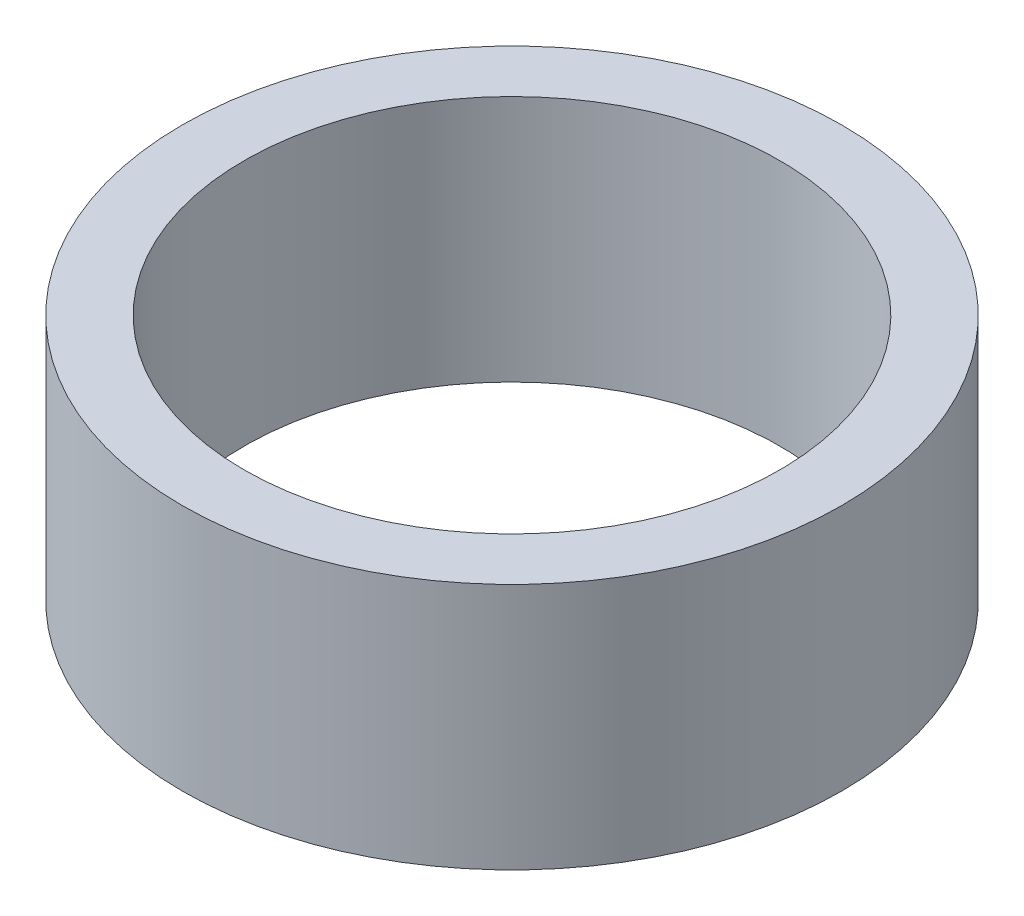
ISO-10303-21;
HEADER;
FILE_DESCRIPTION(('STEP AP214'),'2;1');
FILE_NAME('part.step','',(''),(''),'','','');
FILE_SCHEMA(('AUTOMOTIVE_DESIGN { 1 0 10303 214 1 1 1 1 }'));
ENDSEC;
DATA;
#1=APPLICATION_CONTEXT('core data for automotive mechanical design processes');
#2=APPLICATION_PROTOCOL_DEFINITION('international standard','automotive_design',2000,#1);
#3=PRODUCT_CONTEXT('',#1,'mechanical');
#4=PRODUCT('Part','Part','',(#3));
#5=PRODUCT_RELATED_PRODUCT_CATEGORY('part','',(#4));
#6=PRODUCT_DEFINITION_FORMATION('','',#4);
#7=PRODUCT_DEFINITION_CONTEXT('part definition',#1,'design');
#8=PRODUCT_DEFINITION('design','',#6,#7);
#9=PRODUCT_DEFINITION_SHAPE('','',#8);
#10=(LENGTH_UNIT() NAMED_UNIT(*) SI_UNIT(.MILLI.,.METRE.));
#11=(NAMED_UNIT(*) PLANE_ANGLE_UNIT() SI_UNIT($,.RADIAN.));
#12=(NAMED_UNIT(*) SI_UNIT($,.STERADIAN.) SOLID_ANGLE_UNIT());
#13=UNCERTAINTY_MEASURE_WITH_UNIT(LENGTH_MEASURE(1.E-05),#10,'distance_accuracy_value','');
#14=(GEOMETRIC_REPRESENTATION_CONTEXT(3) GLOBAL_UNCERTAINTY_ASSIGNED_CONTEXT((#13)) GLOBAL_UNIT_ASSIGNED_CONTEXT((#10,
#11,#12)) REPRESENTATION_CONTEXT('',''));
#15=CARTESIAN_POINT('',(0.,0.,0.));
#16=DIRECTION('',(0.,0.,1.));
#17=DIRECTION('',(1.,0.,0.));
#18=AXIS2_PLACEMENT_3D('',#15,#16,#17);
#19=CARTESIAN_POINT('',(0.,3.,0.));
#20=DIRECTION('',(0.,1.,0.));
#21=DIRECTION('',(0.,0.,1.));
#22=AXIS2_PLACEMENT_3D('',#19,#20,#21);
#23=PLANE('',#22);
#24=CARTESIAN_POINT('',(0.,3.,0.));
#25=DIRECTION('',(0.,1.,0.));
#26=DIRECTION('',(0.,0.,1.));
#27=AXIS2_PLACEMENT_3D('',#24,#25,#26);
#28=CIRCLE('',#27,4.);
#29=CARTESIAN_POINT('',(0.,3.,4.));
#30=VERTEX_POINT('',#29);
#31=EDGE_CURVE('E10',#30,#30,#28,.T.);
#32=ORIENTED_EDGE('',*,*,#31,.T.);
#33=EDGE_LOOP('',(#32));
#34=FACE_BOUND('',#33,.T.);
#35=CARTESIAN_POINT('',(0.,3.,0.));
#36=DIRECTION('',(0.,1.,0.));
#37=DIRECTION('',(0.,0.,1.));
#38=AXIS2_PLACEMENT_3D('',#35,#36,#37);
#39=CIRCLE('',#38,3.25);
#40=CARTESIAN_POINT('',(0.,3.,3.25));
#41=VERTEX_POINT('',#40);
#42=EDGE_CURVE('E50',#41,#41,#39,.T.);
#43=ORIENTED_EDGE('',*,*,#42,.F.);
#44=EDGE_LOOP('',(#43));
#45=FACE_BOUND('',#44,.T.);
#46=ADVANCED_FACE('F37',(#34,#45),#23,.T.);
#47=CARTESIAN_POINT('',(0.,0.,0.));
#48=DIRECTION('',(0.,1.,0.));
#49=DIRECTION('',(0.,0.,1.));
#50=AXIS2_PLACEMENT_3D('',#47,#48,#49);
#51=PLANE('',#50);
#52=CARTESIAN_POINT('',(0.,0.,0.));
#53=DIRECTION('',(0.,1.,0.));
#54=DIRECTION('',(0.,0.,1.));
#55=AXIS2_PLACEMENT_3D('',#52,#53,#54);
#56=CIRCLE('',#55,4.);
#57=CARTESIAN_POINT('',(0.,0.,4.));
#58=VERTEX_POINT('',#57);
#59=EDGE_CURVE('E41',#58,#58,#56,.T.);
#60=ORIENTED_EDGE('',*,*,#59,.F.);
#61=EDGE_LOOP('',(#60));
#62=FACE_BOUND('',#61,.T.);
#63=CARTESIAN_POINT('',(0.,0.,0.));
#64=DIRECTION('',(0.,1.,0.));
#65=DIRECTION('',(0.,0.,1.));
#66=AXIS2_PLACEMENT_3D('',#63,#64,#65);
#67=CIRCLE('',#66,3.25);
#68=CARTESIAN_POINT('',(0.,0.,3.25));
#69=VERTEX_POINT('',#68);
#70=EDGE_CURVE('E52',#69,#69,#67,.T.);
#71=ORIENTED_EDGE('',*,*,#70,.T.);
#72=EDGE_LOOP('',(#71));
#73=FACE_BOUND('',#72,.T.);
#74=ADVANCED_FACE('F64',(#62,#73),#51,.F.);
#75=CARTESIAN_POINT('',(0.,3.,0.));
#76=DIRECTION('',(0.,-1.,0.));
#77=DIRECTION('',(0.,0.,-1.));
#78=AXIS2_PLACEMENT_3D('',#75,#76,#77);
#79=CYLINDRICAL_SURFACE('',#78,4.);
#80=ORIENTED_EDGE('',*,*,#31,.F.);
#81=EDGE_LOOP('',(#80));
#82=FACE_BOUND('',#81,.T.);
#83=ORIENTED_EDGE('',*,*,#59,.T.);
#84=EDGE_LOOP('',(#83));
#85=FACE_BOUND('',#84,.T.);
#86=ADVANCED_FACE('F39',(#82,#85),#79,.T.);
#87=CARTESIAN_POINT('',(0.,3.,0.));
#88=DIRECTION('',(0.,-1.,0.));
#89=DIRECTION('',(0.,0.,-1.));
#90=AXIS2_PLACEMENT_3D('',#87,#88,#89);
#91=CYLINDRICAL_SURFACE('',#90,3.25);
#92=ORIENTED_EDGE('',*,*,#42,.T.);
#93=EDGE_LOOP('',(#92));
#94=FACE_BOUND('',#93,.T.);
#95=ORIENTED_EDGE('',*,*,#70,.F.);
#96=EDGE_LOOP('',(#95));
#97=FACE_BOUND('',#96,.T.);
#98=ADVANCED_FACE('F60',(#94,#97),#91,.F.);
#99=CLOSED_SHELL('',(#46,#74,#86,#98));
#100=MANIFOLD_SOLID_BREP('B2',#99);
#101=ADVANCED_BREP_SHAPE_REPRESENTATION('',(#18,#100),#14);
#102=SHAPE_DEFINITION_REPRESENTATION(#9,#101);
ENDSEC;
END-ISO-10303-21;
